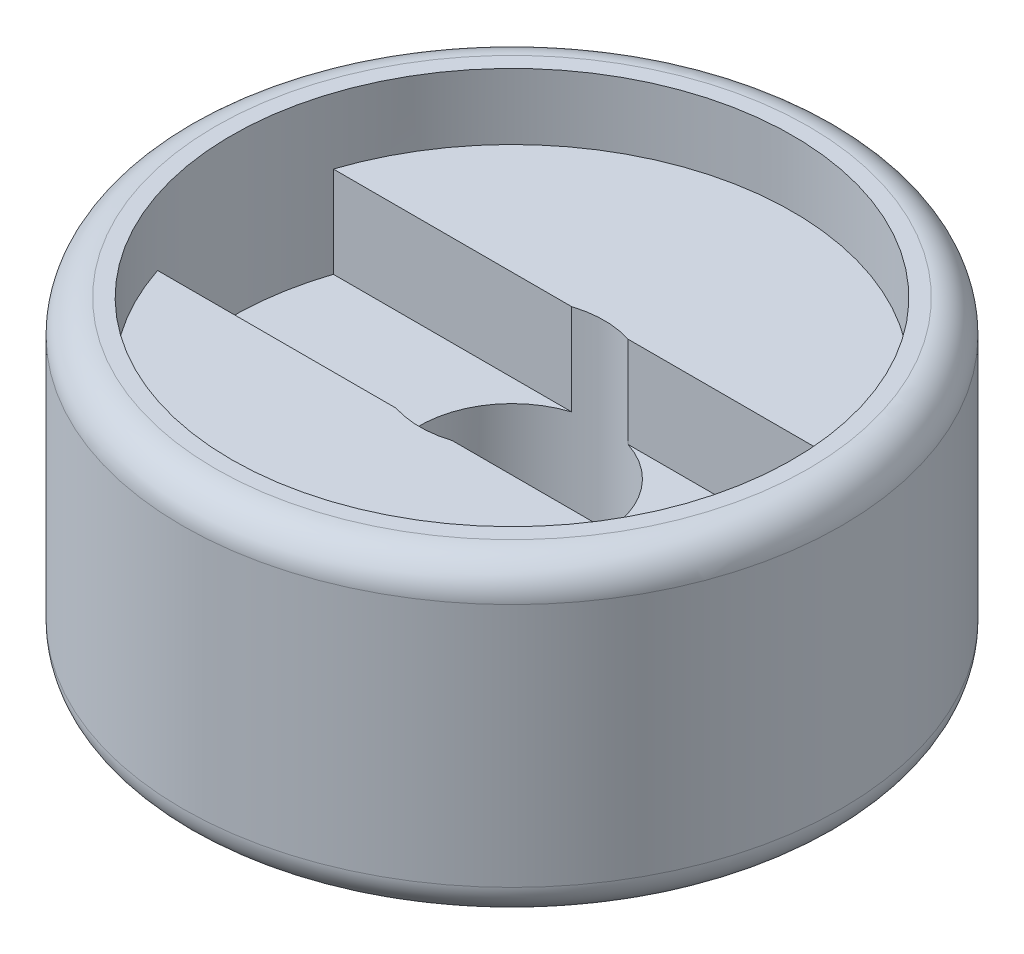
ISO-10303-21;
HEADER;
FILE_DESCRIPTION(('STEP AP214'),'2;1');
FILE_NAME('part.step','',(''),(''),'','','');
FILE_SCHEMA(('AUTOMOTIVE_DESIGN { 1 0 10303 214 1 1 1 1 }'));
ENDSEC;
DATA;
#1=APPLICATION_CONTEXT('core data for automotive mechanical design processes');
#2=APPLICATION_PROTOCOL_DEFINITION('international standard','automotive_design',2000,#1);
#3=PRODUCT_CONTEXT('',#1,'mechanical');
#4=PRODUCT('Part','Part','',(#3));
#5=PRODUCT_RELATED_PRODUCT_CATEGORY('part','',(#4));
#6=PRODUCT_DEFINITION_FORMATION('','',#4);
#7=PRODUCT_DEFINITION_CONTEXT('part definition',#1,'design');
#8=PRODUCT_DEFINITION('design','',#6,#7);
#9=PRODUCT_DEFINITION_SHAPE('','',#8);
#10=(LENGTH_UNIT() NAMED_UNIT(*) SI_UNIT(.MILLI.,.METRE.));
#11=(NAMED_UNIT(*) PLANE_ANGLE_UNIT() SI_UNIT($,.RADIAN.));
#12=(NAMED_UNIT(*) SI_UNIT($,.STERADIAN.) SOLID_ANGLE_UNIT());
#13=UNCERTAINTY_MEASURE_WITH_UNIT(LENGTH_MEASURE(1.E-05),#10,'distance_accuracy_value','');
#14=(GEOMETRIC_REPRESENTATION_CONTEXT(3) GLOBAL_UNCERTAINTY_ASSIGNED_CONTEXT((#13)) GLOBAL_UNIT_ASSIGNED_CONTEXT((#10,
#11,#12)) REPRESENTATION_CONTEXT('',''));
#15=CARTESIAN_POINT('',(0.,0.,0.));
#16=DIRECTION('',(0.,0.,1.));
#17=DIRECTION('',(1.,0.,0.));
#18=AXIS2_PLACEMENT_3D('',#15,#16,#17);
#19=CARTESIAN_POINT('',(0.,7.,0.));
#20=DIRECTION('',(0.,1.,0.));
#21=DIRECTION('',(0.,0.,1.));
#22=AXIS2_PLACEMENT_3D('',#19,#20,#21);
#23=PLANE('',#22);
#24=DIRECTION('',(1.,0.,0.));
#25=VECTOR('',#24,1.);
#26=CARTESIAN_POINT('',(0.,7.,-4.));
#27=LINE('',#26,#25);
#28=CARTESIAN_POINT('',(-12.1326264675049,7.,-4.));
#29=VERTEX_POINT('',#28);
#30=CARTESIAN_POINT('',(-1.28062484748657,7.,-4.));
#31=VERTEX_POINT('',#30);
#32=EDGE_CURVE('E122',#29,#31,#27,.T.);
#33=ORIENTED_EDGE('',*,*,#32,.F.);
#34=CARTESIAN_POINT('',(0.,7.,0.));
#35=DIRECTION('',(0.,1.,0.));
#36=DIRECTION('',(0.,0.,1.));
#37=AXIS2_PLACEMENT_3D('',#34,#35,#36);
#38=CIRCLE('',#37,12.775);
#39=CARTESIAN_POINT('',(-12.1326264675049,7.,4.));
#40=VERTEX_POINT('',#39);
#41=EDGE_CURVE('E108',#40,#29,#38,.F.);
#42=ORIENTED_EDGE('',*,*,#41,.F.);
#43=DIRECTION('',(1.,0.,0.));
#44=VECTOR('',#43,1.);
#45=CARTESIAN_POINT('',(0.,7.,4.));
#46=LINE('',#45,#44);
#47=CARTESIAN_POINT('',(-1.28062484748657,7.,4.));
#48=VERTEX_POINT('',#47);
#49=EDGE_CURVE('E120',#40,#48,#46,.T.);
#50=ORIENTED_EDGE('',*,*,#49,.T.);
#51=CARTESIAN_POINT('',(0.,7.,0.));
#52=DIRECTION('',(0.,1.,0.));
#53=DIRECTION('',(0.,0.,1.));
#54=AXIS2_PLACEMENT_3D('',#51,#52,#53);
#55=CIRCLE('',#54,4.2);
#56=EDGE_CURVE('E171',#31,#48,#55,.T.);
#57=ORIENTED_EDGE('',*,*,#56,.F.);
#58=EDGE_LOOP('',(#33,#42,#50,#57));
#59=FACE_BOUND('',#58,.T.);
#60=ADVANCED_FACE('F41',(#59),#23,.T.);
#61=CARTESIAN_POINT('',(1.28062484748657,7.,4.));
#62=VERTEX_POINT('',#61);
#63=CARTESIAN_POINT('',(12.1326264675049,7.,4.));
#64=VERTEX_POINT('',#63);
#65=EDGE_CURVE('E64',#62,#64,#46,.T.);
#66=ORIENTED_EDGE('',*,*,#65,.T.);
#67=CARTESIAN_POINT('',(12.1326264675049,7.,-4.));
#68=VERTEX_POINT('',#67);
#69=EDGE_CURVE('E124',#68,#64,#38,.F.);
#70=ORIENTED_EDGE('',*,*,#69,.F.);
#71=CARTESIAN_POINT('',(1.28062484748657,7.,-4.));
#72=VERTEX_POINT('',#71);
#73=EDGE_CURVE('E152',#72,#68,#27,.T.);
#74=ORIENTED_EDGE('',*,*,#73,.F.);
#75=EDGE_CURVE('E170',#62,#72,#55,.T.);
#76=ORIENTED_EDGE('',*,*,#75,.F.);
#77=EDGE_LOOP('',(#66,#70,#74,#76));
#78=FACE_BOUND('',#77,.T.);
#79=ADVANCED_FACE('F278',(#78),#23,.T.);
#80=CARTESIAN_POINT('',(0.,11.15,-4.));
#81=DIRECTION('',(0.,0.,-1.));
#82=DIRECTION('',(-1.,0.,0.));
#83=AXIS2_PLACEMENT_3D('',#80,#81,#82);
#84=PLANE('',#83);
#85=DIRECTION('',(0.,1.,0.));
#86=VECTOR('',#85,1.);
#87=CARTESIAN_POINT('',(-12.1326264675049,-35.4264068711929,-4.));
#88=LINE('',#87,#86);
#89=CARTESIAN_POINT('',(-12.1326264675049,11.15,-4.));
#90=VERTEX_POINT('',#89);
#91=EDGE_CURVE('E226',#29,#90,#88,.T.);
#92=ORIENTED_EDGE('',*,*,#91,.F.);
#93=ORIENTED_EDGE('',*,*,#32,.T.);
#94=DIRECTION('',(0.,-1.,0.));
#95=VECTOR('',#94,1.);
#96=CARTESIAN_POINT('',(-1.28062484748657,11.15,-4.));
#97=LINE('',#96,#95);
#98=CARTESIAN_POINT('',(-1.28062484748657,11.15,-4.));
#99=VERTEX_POINT('',#98);
#100=EDGE_CURVE('E162',#99,#31,#97,.T.);
#101=ORIENTED_EDGE('',*,*,#100,.F.);
#102=DIRECTION('',(1.,0.,0.));
#103=VECTOR('',#102,1.);
#104=CARTESIAN_POINT('',(0.,11.15,-4.));
#105=LINE('',#104,#103);
#106=EDGE_CURVE('E148',#90,#99,#105,.T.);
#107=ORIENTED_EDGE('',*,*,#106,.F.);
#108=EDGE_LOOP('',(#92,#93,#101,#107));
#109=FACE_BOUND('',#108,.T.);
#110=ADVANCED_FACE('F263',(#109),#84,.F.);
#111=DIRECTION('',(0.,1.,0.));
#112=VECTOR('',#111,1.);
#113=CARTESIAN_POINT('',(12.1326264675049,-35.4264068711929,-4.));
#114=LINE('',#113,#112);
#115=CARTESIAN_POINT('',(12.1326264675049,11.15,-4.));
#116=VERTEX_POINT('',#115);
#117=EDGE_CURVE('E223',#116,#68,#114,.F.);
#118=ORIENTED_EDGE('',*,*,#117,.F.);
#119=CARTESIAN_POINT('',(1.28062484748657,11.15,-4.));
#120=VERTEX_POINT('',#119);
#121=EDGE_CURVE('E153',#120,#116,#105,.T.);
#122=ORIENTED_EDGE('',*,*,#121,.F.);
#123=DIRECTION('',(0.,-1.,0.));
#124=VECTOR('',#123,1.);
#125=CARTESIAN_POINT('',(1.28062484748657,11.15,-4.));
#126=LINE('',#125,#124);
#127=EDGE_CURVE('E158',#120,#72,#126,.T.);
#128=ORIENTED_EDGE('',*,*,#127,.T.);
#129=ORIENTED_EDGE('',*,*,#73,.T.);
#130=EDGE_LOOP('',(#118,#122,#128,#129));
#131=FACE_BOUND('',#130,.T.);
#132=ADVANCED_FACE('F274',(#131),#84,.F.);
#133=CARTESIAN_POINT('',(0.,11.15,0.));
#134=DIRECTION('',(0.,1.,0.));
#135=DIRECTION('',(0.,0.,1.));
#136=AXIS2_PLACEMENT_3D('',#133,#134,#135);
#137=PLANE('',#136);
#138=ORIENTED_EDGE('',*,*,#121,.T.);
#139=CARTESIAN_POINT('',(0.,11.15,0.));
#140=DIRECTION('',(0.,1.,0.));
#141=DIRECTION('',(0.,0.,1.));
#142=AXIS2_PLACEMENT_3D('',#139,#140,#141);
#143=CIRCLE('',#142,12.775);
#144=EDGE_CURVE('E115',#116,#90,#143,.T.);
#145=ORIENTED_EDGE('',*,*,#144,.T.);
#146=ORIENTED_EDGE('',*,*,#106,.T.);
#147=CARTESIAN_POINT('',(0.,11.15,0.));
#148=DIRECTION('',(0.,1.,0.));
#149=DIRECTION('',(0.,0.,1.));
#150=AXIS2_PLACEMENT_3D('',#147,#148,#149);
#151=CIRCLE('',#150,4.2);
#152=EDGE_CURVE('E151',#99,#120,#151,.F.);
#153=ORIENTED_EDGE('',*,*,#152,.T.);
#154=EDGE_LOOP('',(#138,#145,#146,#153));
#155=FACE_BOUND('',#154,.T.);
#156=ADVANCED_FACE('F267',(#155),#137,.T.);
#157=CARTESIAN_POINT('',(0.,11.15,4.));
#158=DIRECTION('',(0.,0.,-1.));
#159=DIRECTION('',(-1.,0.,0.));
#160=AXIS2_PLACEMENT_3D('',#157,#158,#159);
#161=PLANE('',#160);
#162=ORIENTED_EDGE('',*,*,#49,.F.);
#163=DIRECTION('',(0.,1.,0.));
#164=VECTOR('',#163,1.);
#165=CARTESIAN_POINT('',(-12.1326264675049,-35.4264068711929,4.));
#166=LINE('',#165,#164);
#167=CARTESIAN_POINT('',(-12.1326264675049,11.15,4.));
#168=VERTEX_POINT('',#167);
#169=EDGE_CURVE('E105',#40,#168,#166,.T.);
#170=ORIENTED_EDGE('',*,*,#169,.T.);
#171=DIRECTION('',(1.,0.,0.));
#172=VECTOR('',#171,1.);
#173=CARTESIAN_POINT('',(0.,11.15,4.));
#174=LINE('',#173,#172);
#175=CARTESIAN_POINT('',(-1.28062484748657,11.15,4.));
#176=VERTEX_POINT('',#175);
#177=EDGE_CURVE('E135',#168,#176,#174,.T.);
#178=ORIENTED_EDGE('',*,*,#177,.T.);
#179=DIRECTION('',(0.,-1.,0.));
#180=VECTOR('',#179,1.);
#181=CARTESIAN_POINT('',(-1.28062484748657,11.15,4.));
#182=LINE('',#181,#180);
#183=EDGE_CURVE('E128',#176,#48,#182,.T.);
#184=ORIENTED_EDGE('',*,*,#183,.T.);
#185=EDGE_LOOP('',(#162,#170,#178,#184));
#186=FACE_BOUND('',#185,.T.);
#187=ADVANCED_FACE('F126',(#186),#161,.T.);
#188=CARTESIAN_POINT('',(1.28062484748657,11.15,4.));
#189=VERTEX_POINT('',#188);
#190=CARTESIAN_POINT('',(12.1326264675049,11.15,4.));
#191=VERTEX_POINT('',#190);
#192=EDGE_CURVE('E248',#189,#191,#174,.T.);
#193=ORIENTED_EDGE('',*,*,#192,.T.);
#194=DIRECTION('',(0.,1.,0.));
#195=VECTOR('',#194,1.);
#196=CARTESIAN_POINT('',(12.1326264675049,-35.4264068711929,4.));
#197=LINE('',#196,#195);
#198=EDGE_CURVE('E57',#191,#64,#197,.F.);
#199=ORIENTED_EDGE('',*,*,#198,.T.);
#200=ORIENTED_EDGE('',*,*,#65,.F.);
#201=DIRECTION('',(0.,-1.,0.));
#202=VECTOR('',#201,1.);
#203=CARTESIAN_POINT('',(1.28062484748657,11.15,4.));
#204=LINE('',#203,#202);
#205=EDGE_CURVE('E145',#189,#62,#204,.T.);
#206=ORIENTED_EDGE('',*,*,#205,.F.);
#207=EDGE_LOOP('',(#193,#199,#200,#206));
#208=FACE_BOUND('',#207,.T.);
#209=ADVANCED_FACE('F279',(#208),#161,.T.);
#210=CARTESIAN_POINT('',(0.,11.15,0.));
#211=DIRECTION('',(0.,1.,0.));
#212=DIRECTION('',(0.,0.,1.));
#213=AXIS2_PLACEMENT_3D('',#210,#211,#212);
#214=PLANE('',#213);
#215=ORIENTED_EDGE('',*,*,#177,.F.);
#216=CARTESIAN_POINT('',(0.,11.15,0.));
#217=DIRECTION('',(0.,1.,0.));
#218=DIRECTION('',(0.,0.,1.));
#219=AXIS2_PLACEMENT_3D('',#216,#217,#218);
#220=CIRCLE('',#219,12.775);
#221=EDGE_CURVE('E110',#168,#191,#220,.T.);
#222=ORIENTED_EDGE('',*,*,#221,.T.);
#223=ORIENTED_EDGE('',*,*,#192,.F.);
#224=CARTESIAN_POINT('',(0.,11.15,0.));
#225=DIRECTION('',(0.,1.,0.));
#226=DIRECTION('',(0.,0.,1.));
#227=AXIS2_PLACEMENT_3D('',#224,#225,#226);
#228=CIRCLE('',#227,4.2);
#229=EDGE_CURVE('E141',#189,#176,#228,.F.);
#230=ORIENTED_EDGE('',*,*,#229,.T.);
#231=EDGE_LOOP('',(#215,#222,#223,#230));
#232=FACE_BOUND('',#231,.T.);
#233=ADVANCED_FACE('F199',(#232),#214,.T.);
#234=CARTESIAN_POINT('',(0.,7.,0.));
#235=DIRECTION('',(0.,-1.,0.));
#236=DIRECTION('',(0.,0.,-1.));
#237=AXIS2_PLACEMENT_3D('',#234,#235,#236);
#238=CYLINDRICAL_SURFACE('',#237,15.);
#239=CARTESIAN_POINT('',(0.,1.5,0.));
#240=DIRECTION('',(0.,1.,0.));
#241=DIRECTION('',(0.,0.,1.));
#242=AXIS2_PLACEMENT_3D('',#239,#240,#241);
#243=CIRCLE('',#242,15.);
#244=CARTESIAN_POINT('',(0.,1.5,15.));
#245=VERTEX_POINT('',#244);
#246=EDGE_CURVE('E180',#245,#245,#243,.T.);
#247=ORIENTED_EDGE('',*,*,#246,.T.);
#248=EDGE_LOOP('',(#247));
#249=FACE_BOUND('',#248,.T.);
#250=CARTESIAN_POINT('',(0.,12.65,0.));
#251=DIRECTION('',(0.,1.,0.));
#252=DIRECTION('',(0.,0.,1.));
#253=AXIS2_PLACEMENT_3D('',#250,#251,#252);
#254=CIRCLE('',#253,15.);
#255=CARTESIAN_POINT('',(0.,12.65,15.));
#256=VERTEX_POINT('',#255);
#257=EDGE_CURVE('E176',#256,#256,#254,.F.);
#258=ORIENTED_EDGE('',*,*,#257,.T.);
#259=EDGE_LOOP('',(#258));
#260=FACE_BOUND('',#259,.T.);
#261=ADVANCED_FACE('F196',(#249,#260),#238,.T.);
#262=CARTESIAN_POINT('',(0.,0.,0.));
#263=DIRECTION('',(0.,1.,0.));
#264=DIRECTION('',(0.,0.,1.));
#265=AXIS2_PLACEMENT_3D('',#262,#263,#264);
#266=PLANE('',#265);
#267=CARTESIAN_POINT('',(0.,0.,0.));
#268=DIRECTION('',(0.,1.,0.));
#269=DIRECTION('',(0.,0.,1.));
#270=AXIS2_PLACEMENT_3D('',#267,#268,#269);
#271=CIRCLE('',#270,13.5);
#272=CARTESIAN_POINT('',(0.,0.,13.5));
#273=VERTEX_POINT('',#272);
#274=EDGE_CURVE('E50',#273,#273,#271,.F.);
#275=ORIENTED_EDGE('',*,*,#274,.T.);
#276=EDGE_LOOP('',(#275));
#277=FACE_BOUND('',#276,.T.);
#278=CARTESIAN_POINT('',(-8.22724133595217,0.,-4.75));
#279=DIRECTION('',(0.,1.,0.));
#280=DIRECTION('',(0.,0.,1.));
#281=AXIS2_PLACEMENT_3D('',#278,#279,#280);
#282=CIRCLE('',#281,2.1);
#283=CARTESIAN_POINT('',(-8.22724133595217,0.,-6.85));
#284=VERTEX_POINT('',#283);
#285=EDGE_CURVE('E137',#284,#284,#282,.T.);
#286=ORIENTED_EDGE('',*,*,#285,.T.);
#287=EDGE_LOOP('',(#286));
#288=FACE_BOUND('',#287,.T.);
#289=CARTESIAN_POINT('',(0.,0.,9.5));
#290=DIRECTION('',(0.,1.,0.));
#291=DIRECTION('',(0.,0.,1.));
#292=AXIS2_PLACEMENT_3D('',#289,#290,#291);
#293=CIRCLE('',#292,2.1);
#294=CARTESIAN_POINT('',(0.,0.,7.4));
#295=VERTEX_POINT('',#294);
#296=EDGE_CURVE('E237',#295,#295,#293,.T.);
#297=ORIENTED_EDGE('',*,*,#296,.T.);
#298=EDGE_LOOP('',(#297));
#299=FACE_BOUND('',#298,.T.);
#300=CARTESIAN_POINT('',(8.22724133595217,0.,-4.75000000000001));
#301=DIRECTION('',(0.,1.,0.));
#302=DIRECTION('',(0.,0.,1.));
#303=AXIS2_PLACEMENT_3D('',#300,#301,#302);
#304=CIRCLE('',#303,2.1);
#305=CARTESIAN_POINT('',(8.22724133595217,0.,-6.85));
#306=VERTEX_POINT('',#305);
#307=EDGE_CURVE('E228',#306,#306,#304,.T.);
#308=ORIENTED_EDGE('',*,*,#307,.T.);
#309=EDGE_LOOP('',(#308));
#310=FACE_BOUND('',#309,.T.);
#311=CARTESIAN_POINT('',(0.,0.,0.));
#312=DIRECTION('',(0.,1.,0.));
#313=DIRECTION('',(0.,0.,1.));
#314=AXIS2_PLACEMENT_3D('',#311,#312,#313);
#315=CIRCLE('',#314,4.2);
#316=CARTESIAN_POINT('',(0.,0.,4.2));
#317=VERTEX_POINT('',#316);
#318=EDGE_CURVE('E166',#317,#317,#315,.T.);
#319=ORIENTED_EDGE('',*,*,#318,.T.);
#320=EDGE_LOOP('',(#319));
#321=FACE_BOUND('',#320,.T.);
#322=ADVANCED_FACE('F187',(#277,#288,#299,#310,#321),#266,.F.);
#323=CARTESIAN_POINT('',(0.,18.879393923934,0.));
#324=DIRECTION('',(0.,-1.,0.));
#325=DIRECTION('',(0.,0.,-1.));
#326=AXIS2_PLACEMENT_3D('',#323,#324,#325);
#327=CYLINDRICAL_SURFACE('',#326,4.2);
#328=ORIENTED_EDGE('',*,*,#318,.F.);
#329=EDGE_LOOP('',(#328));
#330=FACE_BOUND('',#329,.T.);
#331=ORIENTED_EDGE('',*,*,#56,.T.);
#332=ORIENTED_EDGE('',*,*,#183,.F.);
#333=ORIENTED_EDGE('',*,*,#229,.F.);
#334=ORIENTED_EDGE('',*,*,#205,.T.);
#335=ORIENTED_EDGE('',*,*,#75,.T.);
#336=ORIENTED_EDGE('',*,*,#127,.F.);
#337=ORIENTED_EDGE('',*,*,#152,.F.);
#338=ORIENTED_EDGE('',*,*,#100,.T.);
#339=EDGE_LOOP('',(#331,#332,#333,#334,#335,#336,#337,#338));
#340=FACE_BOUND('',#339,.T.);
#341=ADVANCED_FACE('F257',(#330,#340),#327,.F.);
#342=CARTESIAN_POINT('',(8.22724133595217,6.5,-4.75000000000001));
#343=DIRECTION('',(0.,-1.,0.));
#344=DIRECTION('',(0.,0.,-1.));
#345=AXIS2_PLACEMENT_3D('',#342,#343,#344);
#346=CYLINDRICAL_SURFACE('',#345,2.1);
#347=CARTESIAN_POINT('',(8.22724133595217,6.5,-4.75000000000001));
#348=DIRECTION('',(0.,1.,0.));
#349=DIRECTION('',(0.,0.,1.));
#350=AXIS2_PLACEMENT_3D('',#347,#348,#349);
#351=CIRCLE('',#350,2.1);
#352=CARTESIAN_POINT('',(8.22724133595217,6.5,-6.85));
#353=VERTEX_POINT('',#352);
#354=EDGE_CURVE('E241',#353,#353,#351,.T.);
#355=CARTESIAN_POINT('',(8.22724133595217,6.5,-6.85));
#356=CARTESIAN_POINT('',(8.22724133595217,6.43229166666667,-6.85));
#357=CARTESIAN_POINT('',(8.22724133595217,6.36458333333333,-6.85));
#358=CARTESIAN_POINT('',(8.22724133595217,6.22916666666667,-6.85));
#359=CARTESIAN_POINT('',(8.22724133595217,6.16145833333333,-6.85));
#360=CARTESIAN_POINT('',(8.22724133595217,6.02604166666667,-6.85));
#361=CARTESIAN_POINT('',(8.22724133595217,5.95833333333333,-6.85));
#362=CARTESIAN_POINT('',(8.22724133595217,5.82291666666667,-6.85));
#363=CARTESIAN_POINT('',(8.22724133595217,5.75520833333333,-6.85));
#364=CARTESIAN_POINT('',(8.22724133595217,5.61979166666667,-6.85));
#365=CARTESIAN_POINT('',(8.22724133595217,5.55208333333333,-6.85));
#366=CARTESIAN_POINT('',(8.22724133595217,5.41666666666667,-6.85));
#367=CARTESIAN_POINT('',(8.22724133595217,5.34895833333333,-6.85));
#368=CARTESIAN_POINT('',(8.22724133595217,5.21354166666667,-6.85));
#369=CARTESIAN_POINT('',(8.22724133595217,5.14583333333333,-6.85));
#370=CARTESIAN_POINT('',(8.22724133595217,5.01041666666667,-6.85));
#371=CARTESIAN_POINT('',(8.22724133595217,4.94270833333333,-6.85));
#372=CARTESIAN_POINT('',(8.22724133595217,4.80729166666667,-6.85));
#373=CARTESIAN_POINT('',(8.22724133595217,4.73958333333333,-6.85));
#374=CARTESIAN_POINT('',(8.22724133595217,4.60416666666667,-6.85));
#375=CARTESIAN_POINT('',(8.22724133595217,4.53645833333333,-6.85));
#376=CARTESIAN_POINT('',(8.22724133595217,4.40104166666667,-6.85));
#377=CARTESIAN_POINT('',(8.22724133595217,4.33333333333333,-6.85));
#378=CARTESIAN_POINT('',(8.22724133595217,4.19791666666667,-6.85));
#379=CARTESIAN_POINT('',(8.22724133595217,4.13020833333333,-6.85));
#380=CARTESIAN_POINT('',(8.22724133595217,3.99479166666667,-6.85));
#381=CARTESIAN_POINT('',(8.22724133595217,3.92708333333333,-6.85));
#382=CARTESIAN_POINT('',(8.22724133595217,3.79166666666667,-6.85));
#383=CARTESIAN_POINT('',(8.22724133595217,3.72395833333333,-6.85));
#384=CARTESIAN_POINT('',(8.22724133595217,3.58854166666667,-6.85));
#385=CARTESIAN_POINT('',(8.22724133595217,3.52083333333333,-6.85));
#386=CARTESIAN_POINT('',(8.22724133595217,3.38541666666667,-6.85));
#387=CARTESIAN_POINT('',(8.22724133595217,3.31770833333333,-6.85));
#388=CARTESIAN_POINT('',(8.22724133595217,3.18229166666667,-6.85));
#389=CARTESIAN_POINT('',(8.22724133595217,3.11458333333333,-6.85));
#390=CARTESIAN_POINT('',(8.22724133595217,2.97916666666667,-6.85));
#391=CARTESIAN_POINT('',(8.22724133595217,2.91145833333333,-6.85));
#392=CARTESIAN_POINT('',(8.22724133595217,2.77604166666667,-6.85));
#393=CARTESIAN_POINT('',(8.22724133595217,2.70833333333333,-6.85));
#394=CARTESIAN_POINT('',(8.22724133595217,2.57291666666667,-6.85));
#395=CARTESIAN_POINT('',(8.22724133595217,2.50520833333333,-6.85));
#396=CARTESIAN_POINT('',(8.22724133595217,2.36979166666667,-6.85));
#397=CARTESIAN_POINT('',(8.22724133595217,2.30208333333333,-6.85));
#398=CARTESIAN_POINT('',(8.22724133595217,2.16666666666667,-6.85));
#399=CARTESIAN_POINT('',(8.22724133595217,2.09895833333333,-6.85));
#400=CARTESIAN_POINT('',(8.22724133595217,1.96354166666667,-6.85));
#401=CARTESIAN_POINT('',(8.22724133595217,1.89583333333333,-6.85));
#402=CARTESIAN_POINT('',(8.22724133595217,1.76041666666667,-6.85));
#403=CARTESIAN_POINT('',(8.22724133595217,1.69270833333333,-6.85));
#404=CARTESIAN_POINT('',(8.22724133595217,1.55729166666667,-6.85));
#405=CARTESIAN_POINT('',(8.22724133595217,1.48958333333333,-6.85));
#406=CARTESIAN_POINT('',(8.22724133595217,1.35416666666667,-6.85));
#407=CARTESIAN_POINT('',(8.22724133595217,1.28645833333333,-6.85));
#408=CARTESIAN_POINT('',(8.22724133595217,1.15104166666667,-6.85));
#409=CARTESIAN_POINT('',(8.22724133595217,1.08333333333333,-6.85));
#410=CARTESIAN_POINT('',(8.22724133595217,0.947916666666667,-6.85));
#411=CARTESIAN_POINT('',(8.22724133595217,0.880208333333333,-6.85));
#412=CARTESIAN_POINT('',(8.22724133595217,0.744791666666667,-6.85));
#413=CARTESIAN_POINT('',(8.22724133595217,0.677083333333333,-6.85));
#414=CARTESIAN_POINT('',(8.22724133595217,0.541666666666667,-6.85));
#415=CARTESIAN_POINT('',(8.22724133595217,0.473958333333333,-6.85));
#416=CARTESIAN_POINT('',(8.22724133595217,0.338541666666667,-6.85));
#417=CARTESIAN_POINT('',(8.22724133595217,0.270833333333334,-6.85));
#418=CARTESIAN_POINT('',(8.22724133595217,0.135416666666667,-6.85));
#419=CARTESIAN_POINT('',(8.22724133595217,0.0677083333333334,-6.85));
#420=CARTESIAN_POINT('',(8.22724133595217,0.,-6.85));
#421=B_SPLINE_CURVE_WITH_KNOTS('',3,(#355,#356,#357,#358,#359,#360,#361,#362,#363,#364,#365,
#366,#367,#368,#369,#370,#371,#372,#373,#374,#375,#376,#377,#378,#379,#380,#381,#382,#383,#384,
#385,#386,#387,#388,#389,#390,#391,#392,#393,#394,#395,#396,#397,#398,#399,#400,#401,#402,#403,
#404,#405,#406,#407,#408,#409,#410,#411,#412,#413,#414,#415,#416,#417,#418,#419,#420),
.UNSPECIFIED.,.F.,.F.,(4,2,2,2,2,2,2,2,2,2,2,2,2,2,2,2,2,2,2,2,2,2,2,2,2,2,2,2,2,2,2,2,4),(0.,
0.203125,0.40625,0.609375000000001,0.812500000000001,1.015625,1.21875,1.421875,1.625,1.828125,
2.03125,2.234375,2.4375,2.640625,2.84375,3.046875,3.25,3.453125,3.65625,3.859375,4.0625,
4.265625,4.46875,4.671875,4.875,5.078125,5.28125,5.484375,5.6875,5.890625,6.09375,6.296875,6.5),.UNSPECIFIED.);
#422=EDGE_CURVE('BSEAM300',#353,#306,#421,.T.);
#423=ORIENTED_EDGE('',*,*,#354,.T.);
#424=ORIENTED_EDGE('',*,*,#307,.F.);
#425=ORIENTED_EDGE('',*,*,#422,.T.);
#426=ORIENTED_EDGE('',*,*,#422,.F.);
#427=EDGE_LOOP('',(#423,#425,#424,#426));
#428=FACE_BOUND('',#427,.T.);
#429=ADVANCED_FACE('F300',(#428),#346,.F.);
#430=CARTESIAN_POINT('',(0.,6.5,0.));
#431=DIRECTION('',(0.,1.,0.));
#432=DIRECTION('',(0.,0.,1.));
#433=AXIS2_PLACEMENT_3D('',#430,#431,#432);
#434=PLANE('',#433);
#435=ORIENTED_EDGE('',*,*,#354,.F.);
#436=EDGE_LOOP('',(#435));
#437=FACE_BOUND('',#436,.T.);
#438=ADVANCED_FACE('F305',(#437),#434,.F.);
#439=CARTESIAN_POINT('',(0.,6.5,9.5));
#440=DIRECTION('',(0.,-1.,0.));
#441=DIRECTION('',(0.,0.,-1.));
#442=AXIS2_PLACEMENT_3D('',#439,#440,#441);
#443=CYLINDRICAL_SURFACE('',#442,2.1);
#444=CARTESIAN_POINT('',(0.,6.5,9.5));
#445=DIRECTION('',(0.,1.,0.));
#446=DIRECTION('',(0.,0.,1.));
#447=AXIS2_PLACEMENT_3D('',#444,#445,#446);
#448=CIRCLE('',#447,2.1);
#449=CARTESIAN_POINT('',(0.,6.5,7.4));
#450=VERTEX_POINT('',#449);
#451=EDGE_CURVE('E233',#450,#450,#448,.T.);
#452=CARTESIAN_POINT('',(0.,6.5,7.4));
#453=CARTESIAN_POINT('',(0.,6.43229166666667,7.4));
#454=CARTESIAN_POINT('',(0.,6.36458333333333,7.4));
#455=CARTESIAN_POINT('',(0.,6.22916666666667,7.4));
#456=CARTESIAN_POINT('',(0.,6.16145833333333,7.4));
#457=CARTESIAN_POINT('',(0.,6.02604166666667,7.4));
#458=CARTESIAN_POINT('',(0.,5.95833333333333,7.4));
#459=CARTESIAN_POINT('',(0.,5.82291666666667,7.4));
#460=CARTESIAN_POINT('',(0.,5.75520833333333,7.4));
#461=CARTESIAN_POINT('',(0.,5.61979166666667,7.4));
#462=CARTESIAN_POINT('',(0.,5.55208333333333,7.4));
#463=CARTESIAN_POINT('',(0.,5.41666666666667,7.4));
#464=CARTESIAN_POINT('',(0.,5.34895833333333,7.4));
#465=CARTESIAN_POINT('',(0.,5.21354166666667,7.4));
#466=CARTESIAN_POINT('',(0.,5.14583333333333,7.4));
#467=CARTESIAN_POINT('',(0.,5.01041666666667,7.4));
#468=CARTESIAN_POINT('',(0.,4.94270833333333,7.4));
#469=CARTESIAN_POINT('',(0.,4.80729166666667,7.4));
#470=CARTESIAN_POINT('',(0.,4.73958333333333,7.4));
#471=CARTESIAN_POINT('',(0.,4.60416666666667,7.4));
#472=CARTESIAN_POINT('',(0.,4.53645833333333,7.4));
#473=CARTESIAN_POINT('',(0.,4.40104166666667,7.4));
#474=CARTESIAN_POINT('',(0.,4.33333333333333,7.4));
#475=CARTESIAN_POINT('',(0.,4.19791666666667,7.4));
#476=CARTESIAN_POINT('',(0.,4.13020833333333,7.4));
#477=CARTESIAN_POINT('',(0.,3.99479166666667,7.4));
#478=CARTESIAN_POINT('',(0.,3.92708333333333,7.4));
#479=CARTESIAN_POINT('',(0.,3.79166666666667,7.4));
#480=CARTESIAN_POINT('',(0.,3.72395833333333,7.4));
#481=CARTESIAN_POINT('',(0.,3.58854166666667,7.4));
#482=CARTESIAN_POINT('',(0.,3.52083333333333,7.4));
#483=CARTESIAN_POINT('',(0.,3.38541666666667,7.4));
#484=CARTESIAN_POINT('',(0.,3.31770833333333,7.4));
#485=CARTESIAN_POINT('',(0.,3.18229166666667,7.4));
#486=CARTESIAN_POINT('',(0.,3.11458333333333,7.4));
#487=CARTESIAN_POINT('',(0.,2.97916666666667,7.4));
#488=CARTESIAN_POINT('',(0.,2.91145833333333,7.4));
#489=CARTESIAN_POINT('',(0.,2.77604166666667,7.4));
#490=CARTESIAN_POINT('',(0.,2.70833333333333,7.4));
#491=CARTESIAN_POINT('',(0.,2.57291666666667,7.4));
#492=CARTESIAN_POINT('',(0.,2.50520833333333,7.4));
#493=CARTESIAN_POINT('',(0.,2.36979166666667,7.4));
#494=CARTESIAN_POINT('',(0.,2.30208333333333,7.4));
#495=CARTESIAN_POINT('',(0.,2.16666666666667,7.4));
#496=CARTESIAN_POINT('',(0.,2.09895833333333,7.4));
#497=CARTESIAN_POINT('',(0.,1.96354166666667,7.4));
#498=CARTESIAN_POINT('',(0.,1.89583333333333,7.4));
#499=CARTESIAN_POINT('',(0.,1.76041666666667,7.4));
#500=CARTESIAN_POINT('',(0.,1.69270833333333,7.4));
#501=CARTESIAN_POINT('',(0.,1.55729166666667,7.4));
#502=CARTESIAN_POINT('',(0.,1.48958333333333,7.4));
#503=CARTESIAN_POINT('',(0.,1.35416666666667,7.4));
#504=CARTESIAN_POINT('',(0.,1.28645833333333,7.4));
#505=CARTESIAN_POINT('',(0.,1.15104166666667,7.4));
#506=CARTESIAN_POINT('',(0.,1.08333333333333,7.4));
#507=CARTESIAN_POINT('',(0.,0.947916666666667,7.4));
#508=CARTESIAN_POINT('',(0.,0.880208333333333,7.4));
#509=CARTESIAN_POINT('',(0.,0.744791666666667,7.4));
#510=CARTESIAN_POINT('',(0.,0.677083333333333,7.4));
#511=CARTESIAN_POINT('',(0.,0.541666666666667,7.4));
#512=CARTESIAN_POINT('',(0.,0.473958333333333,7.4));
#513=CARTESIAN_POINT('',(0.,0.338541666666667,7.4));
#514=CARTESIAN_POINT('',(0.,0.270833333333334,7.4));
#515=CARTESIAN_POINT('',(0.,0.135416666666667,7.4));
#516=CARTESIAN_POINT('',(0.,0.0677083333333334,7.4));
#517=CARTESIAN_POINT('',(0.,0.,7.4));
#518=B_SPLINE_CURVE_WITH_KNOTS('',3,(#452,#453,#454,#455,#456,#457,#458,#459,#460,#461,#462,
#463,#464,#465,#466,#467,#468,#469,#470,#471,#472,#473,#474,#475,#476,#477,#478,#479,#480,#481,
#482,#483,#484,#485,#486,#487,#488,#489,#490,#491,#492,#493,#494,#495,#496,#497,#498,#499,#500,
#501,#502,#503,#504,#505,#506,#507,#508,#509,#510,#511,#512,#513,#514,#515,#516,#517),
.UNSPECIFIED.,.F.,.F.,(4,2,2,2,2,2,2,2,2,2,2,2,2,2,2,2,2,2,2,2,2,2,2,2,2,2,2,2,2,2,2,2,4),(0.,
0.203125,0.40625,0.609375000000001,0.812500000000001,1.015625,1.21875,1.421875,1.625,1.828125,
2.03125,2.234375,2.4375,2.640625,2.84375,3.046875,3.25,3.453125,3.65625,3.859375,4.0625,
4.265625,4.46875,4.671875,4.875,5.078125,5.28125,5.484375,5.6875,5.890625,6.09375,6.296875,6.5),.UNSPECIFIED.);
#519=EDGE_CURVE('BSEAM313',#450,#295,#518,.T.);
#520=ORIENTED_EDGE('',*,*,#451,.T.);
#521=ORIENTED_EDGE('',*,*,#296,.F.);
#522=ORIENTED_EDGE('',*,*,#519,.T.);
#523=ORIENTED_EDGE('',*,*,#519,.F.);
#524=EDGE_LOOP('',(#520,#522,#521,#523));
#525=FACE_BOUND('',#524,.T.);
#526=ADVANCED_FACE('F313',(#525),#443,.F.);
#527=CARTESIAN_POINT('',(0.,6.5,0.));
#528=DIRECTION('',(0.,1.,0.));
#529=DIRECTION('',(0.,0.,1.));
#530=AXIS2_PLACEMENT_3D('',#527,#528,#529);
#531=PLANE('',#530);
#532=ORIENTED_EDGE('',*,*,#451,.F.);
#533=EDGE_LOOP('',(#532));
#534=FACE_BOUND('',#533,.T.);
#535=ADVANCED_FACE('F320',(#534),#531,.F.);
#536=CARTESIAN_POINT('',(-8.22724133595217,6.5,-4.75));
#537=DIRECTION('',(0.,-1.,0.));
#538=DIRECTION('',(0.,0.,-1.));
#539=AXIS2_PLACEMENT_3D('',#536,#537,#538);
#540=CYLINDRICAL_SURFACE('',#539,2.1);
#541=CARTESIAN_POINT('',(-8.22724133595217,6.5,-4.75));
#542=DIRECTION('',(0.,1.,0.));
#543=DIRECTION('',(0.,0.,1.));
#544=AXIS2_PLACEMENT_3D('',#541,#542,#543);
#545=CIRCLE('',#544,2.1);
#546=CARTESIAN_POINT('',(-8.22724133595217,6.5,-6.85));
#547=VERTEX_POINT('',#546);
#548=EDGE_CURVE('E131',#547,#547,#545,.T.);
#549=CARTESIAN_POINT('',(-8.22724133595217,6.5,-6.85));
#550=CARTESIAN_POINT('',(-8.22724133595217,6.43229166666667,-6.85));
#551=CARTESIAN_POINT('',(-8.22724133595217,6.36458333333333,-6.85));
#552=CARTESIAN_POINT('',(-8.22724133595217,6.22916666666667,-6.85));
#553=CARTESIAN_POINT('',(-8.22724133595217,6.16145833333333,-6.85));
#554=CARTESIAN_POINT('',(-8.22724133595217,6.02604166666667,-6.85));
#555=CARTESIAN_POINT('',(-8.22724133595217,5.95833333333333,-6.85));
#556=CARTESIAN_POINT('',(-8.22724133595217,5.82291666666667,-6.85));
#557=CARTESIAN_POINT('',(-8.22724133595217,5.75520833333333,-6.85));
#558=CARTESIAN_POINT('',(-8.22724133595217,5.61979166666667,-6.85));
#559=CARTESIAN_POINT('',(-8.22724133595217,5.55208333333333,-6.85));
#560=CARTESIAN_POINT('',(-8.22724133595217,5.41666666666667,-6.85));
#561=CARTESIAN_POINT('',(-8.22724133595217,5.34895833333333,-6.85));
#562=CARTESIAN_POINT('',(-8.22724133595217,5.21354166666667,-6.85));
#563=CARTESIAN_POINT('',(-8.22724133595217,5.14583333333333,-6.85));
#564=CARTESIAN_POINT('',(-8.22724133595217,5.01041666666667,-6.85));
#565=CARTESIAN_POINT('',(-8.22724133595217,4.94270833333333,-6.85));
#566=CARTESIAN_POINT('',(-8.22724133595217,4.80729166666667,-6.85));
#567=CARTESIAN_POINT('',(-8.22724133595217,4.73958333333333,-6.85));
#568=CARTESIAN_POINT('',(-8.22724133595217,4.60416666666667,-6.85));
#569=CARTESIAN_POINT('',(-8.22724133595217,4.53645833333333,-6.85));
#570=CARTESIAN_POINT('',(-8.22724133595217,4.40104166666667,-6.85));
#571=CARTESIAN_POINT('',(-8.22724133595217,4.33333333333333,-6.85));
#572=CARTESIAN_POINT('',(-8.22724133595217,4.19791666666667,-6.85));
#573=CARTESIAN_POINT('',(-8.22724133595217,4.13020833333333,-6.85));
#574=CARTESIAN_POINT('',(-8.22724133595217,3.99479166666667,-6.85));
#575=CARTESIAN_POINT('',(-8.22724133595217,3.92708333333333,-6.85));
#576=CARTESIAN_POINT('',(-8.22724133595217,3.79166666666667,-6.85));
#577=CARTESIAN_POINT('',(-8.22724133595217,3.72395833333333,-6.85));
#578=CARTESIAN_POINT('',(-8.22724133595217,3.58854166666667,-6.85));
#579=CARTESIAN_POINT('',(-8.22724133595217,3.52083333333333,-6.85));
#580=CARTESIAN_POINT('',(-8.22724133595217,3.38541666666667,-6.85));
#581=CARTESIAN_POINT('',(-8.22724133595217,3.31770833333333,-6.85));
#582=CARTESIAN_POINT('',(-8.22724133595217,3.18229166666667,-6.85));
#583=CARTESIAN_POINT('',(-8.22724133595217,3.11458333333333,-6.85));
#584=CARTESIAN_POINT('',(-8.22724133595217,2.97916666666667,-6.85));
#585=CARTESIAN_POINT('',(-8.22724133595217,2.91145833333333,-6.85));
#586=CARTESIAN_POINT('',(-8.22724133595217,2.77604166666667,-6.85));
#587=CARTESIAN_POINT('',(-8.22724133595217,2.70833333333333,-6.85));
#588=CARTESIAN_POINT('',(-8.22724133595217,2.57291666666667,-6.85));
#589=CARTESIAN_POINT('',(-8.22724133595217,2.50520833333333,-6.85));
#590=CARTESIAN_POINT('',(-8.22724133595217,2.36979166666667,-6.85));
#591=CARTESIAN_POINT('',(-8.22724133595217,2.30208333333333,-6.85));
#592=CARTESIAN_POINT('',(-8.22724133595217,2.16666666666667,-6.85));
#593=CARTESIAN_POINT('',(-8.22724133595217,2.09895833333333,-6.85));
#594=CARTESIAN_POINT('',(-8.22724133595217,1.96354166666667,-6.85));
#595=CARTESIAN_POINT('',(-8.22724133595217,1.89583333333333,-6.85));
#596=CARTESIAN_POINT('',(-8.22724133595217,1.76041666666667,-6.85));
#597=CARTESIAN_POINT('',(-8.22724133595217,1.69270833333333,-6.85));
#598=CARTESIAN_POINT('',(-8.22724133595217,1.55729166666667,-6.85));
#599=CARTESIAN_POINT('',(-8.22724133595217,1.48958333333333,-6.85));
#600=CARTESIAN_POINT('',(-8.22724133595217,1.35416666666667,-6.85));
#601=CARTESIAN_POINT('',(-8.22724133595217,1.28645833333333,-6.85));
#602=CARTESIAN_POINT('',(-8.22724133595217,1.15104166666667,-6.85));
#603=CARTESIAN_POINT('',(-8.22724133595217,1.08333333333333,-6.85));
#604=CARTESIAN_POINT('',(-8.22724133595217,0.947916666666667,-6.85));
#605=CARTESIAN_POINT('',(-8.22724133595217,0.880208333333333,-6.85));
#606=CARTESIAN_POINT('',(-8.22724133595217,0.744791666666667,-6.85));
#607=CARTESIAN_POINT('',(-8.22724133595217,0.677083333333333,-6.85));
#608=CARTESIAN_POINT('',(-8.22724133595217,0.541666666666667,-6.85));
#609=CARTESIAN_POINT('',(-8.22724133595217,0.473958333333333,-6.85));
#610=CARTESIAN_POINT('',(-8.22724133595217,0.338541666666667,-6.85));
#611=CARTESIAN_POINT('',(-8.22724133595217,0.270833333333334,-6.85));
#612=CARTESIAN_POINT('',(-8.22724133595217,0.135416666666667,-6.85));
#613=CARTESIAN_POINT('',(-8.22724133595217,0.0677083333333334,-6.85));
#614=CARTESIAN_POINT('',(-8.22724133595217,0.,-6.85));
#615=B_SPLINE_CURVE_WITH_KNOTS('',3,(#549,#550,#551,#552,#553,#554,#555,#556,#557,#558,#559,
#560,#561,#562,#563,#564,#565,#566,#567,#568,#569,#570,#571,#572,#573,#574,#575,#576,#577,#578,
#579,#580,#581,#582,#583,#584,#585,#586,#587,#588,#589,#590,#591,#592,#593,#594,#595,#596,#597,
#598,#599,#600,#601,#602,#603,#604,#605,#606,#607,#608,#609,#610,#611,#612,#613,#614),
.UNSPECIFIED.,.F.,.F.,(4,2,2,2,2,2,2,2,2,2,2,2,2,2,2,2,2,2,2,2,2,2,2,2,2,2,2,2,2,2,2,2,4),(0.,
0.203125,0.40625,0.609375000000001,0.812500000000001,1.015625,1.21875,1.421875,1.625,1.828125,
2.03125,2.234375,2.4375,2.640625,2.84375,3.046875,3.25,3.453125,3.65625,3.859375,4.0625,
4.265625,4.46875,4.671875,4.875,5.078125,5.28125,5.484375,5.6875,5.890625,6.09375,6.296875,6.5),.UNSPECIFIED.);
#616=EDGE_CURVE('BSEAM324',#547,#284,#615,.T.);
#617=ORIENTED_EDGE('',*,*,#548,.T.);
#618=ORIENTED_EDGE('',*,*,#285,.F.);
#619=ORIENTED_EDGE('',*,*,#616,.T.);
#620=ORIENTED_EDGE('',*,*,#616,.F.);
#621=EDGE_LOOP('',(#617,#619,#618,#620));
#622=FACE_BOUND('',#621,.T.);
#623=ADVANCED_FACE('F324',(#622),#540,.F.);
#624=CARTESIAN_POINT('',(0.,6.5,0.));
#625=DIRECTION('',(0.,1.,0.));
#626=DIRECTION('',(0.,0.,1.));
#627=AXIS2_PLACEMENT_3D('',#624,#625,#626);
#628=PLANE('',#627);
#629=ORIENTED_EDGE('',*,*,#548,.F.);
#630=EDGE_LOOP('',(#629));
#631=FACE_BOUND('',#630,.T.);
#632=ADVANCED_FACE('F328',(#631),#628,.F.);
#633=CARTESIAN_POINT('',(0.,-35.4264068711929,0.));
#634=DIRECTION('',(0.,1.,0.));
#635=DIRECTION('',(0.,0.,1.));
#636=AXIS2_PLACEMENT_3D('',#633,#634,#635);
#637=CYLINDRICAL_SURFACE('',#636,12.775);
#638=CARTESIAN_POINT('',(0.,14.15,0.));
#639=DIRECTION('',(0.,1.,0.));
#640=DIRECTION('',(0.,0.,1.));
#641=AXIS2_PLACEMENT_3D('',#638,#639,#640);
#642=CIRCLE('',#641,12.775);
#643=CARTESIAN_POINT('',(0.,14.15,12.775));
#644=VERTEX_POINT('',#643);
#645=EDGE_CURVE('E212',#644,#644,#642,.T.);
#646=ORIENTED_EDGE('',*,*,#645,.T.);
#647=EDGE_LOOP('',(#646));
#648=FACE_BOUND('',#647,.T.);
#649=ORIENTED_EDGE('',*,*,#41,.T.);
#650=ORIENTED_EDGE('',*,*,#91,.T.);
#651=ORIENTED_EDGE('',*,*,#144,.F.);
#652=ORIENTED_EDGE('',*,*,#117,.T.);
#653=ORIENTED_EDGE('',*,*,#69,.T.);
#654=ORIENTED_EDGE('',*,*,#198,.F.);
#655=ORIENTED_EDGE('',*,*,#221,.F.);
#656=ORIENTED_EDGE('',*,*,#169,.F.);
#657=EDGE_LOOP('',(#649,#650,#651,#652,#653,#654,#655,#656));
#658=FACE_BOUND('',#657,.T.);
#659=ADVANCED_FACE('F107',(#648,#658),#637,.F.);
#660=CARTESIAN_POINT('',(0.,14.15,0.));
#661=DIRECTION('',(0.,1.,0.));
#662=DIRECTION('',(0.,0.,1.));
#663=AXIS2_PLACEMENT_3D('',#660,#661,#662);
#664=PLANE('',#663);
#665=CARTESIAN_POINT('',(0.,14.15,0.));
#666=DIRECTION('',(0.,1.,0.));
#667=DIRECTION('',(0.,0.,1.));
#668=AXIS2_PLACEMENT_3D('',#665,#666,#667);
#669=CIRCLE('',#668,13.5);
#670=CARTESIAN_POINT('',(0.,14.15,13.5));
#671=VERTEX_POINT('',#670);
#672=EDGE_CURVE('E11',#671,#671,#669,.T.);
#673=ORIENTED_EDGE('',*,*,#672,.T.);
#674=EDGE_LOOP('',(#673));
#675=FACE_BOUND('',#674,.T.);
#676=ORIENTED_EDGE('',*,*,#645,.F.);
#677=EDGE_LOOP('',(#676));
#678=FACE_BOUND('',#677,.T.);
#679=ADVANCED_FACE('F193',(#675,#678),#664,.T.);
#680=CARTESIAN_POINT('',(0.,1.5,0.));
#681=DIRECTION('',(0.,1.,0.));
#682=DIRECTION('',(0.,0.,1.));
#683=AXIS2_PLACEMENT_3D('',#680,#681,#682);
#684=TOROIDAL_SURFACE('',#683,13.5,1.5);
#685=ORIENTED_EDGE('',*,*,#274,.F.);
#686=EDGE_LOOP('',(#685));
#687=FACE_BOUND('',#686,.T.);
#688=ORIENTED_EDGE('',*,*,#246,.F.);
#689=EDGE_LOOP('',(#688));
#690=FACE_BOUND('',#689,.T.);
#691=ADVANCED_FACE('F190',(#687,#690),#684,.T.);
#692=CARTESIAN_POINT('',(0.,12.65,0.));
#693=DIRECTION('',(0.,1.,0.));
#694=DIRECTION('',(0.,0.,1.));
#695=AXIS2_PLACEMENT_3D('',#692,#693,#694);
#696=TOROIDAL_SURFACE('',#695,13.5,1.5);
#697=ORIENTED_EDGE('',*,*,#257,.F.);
#698=EDGE_LOOP('',(#697));
#699=FACE_BOUND('',#698,.T.);
#700=ORIENTED_EDGE('',*,*,#672,.F.);
#701=EDGE_LOOP('',(#700));
#702=FACE_BOUND('',#701,.T.);
#703=ADVANCED_FACE('F43',(#699,#702),#696,.T.);
#704=CLOSED_SHELL('',(#60,#79,#110,#132,#156,#187,#209,#233,#261,#322,#341,#429,#438,#526,#535,
#623,#632,#659,#679,#691,#703));
#705=MANIFOLD_SOLID_BREP('B2',#704);
#706=ADVANCED_BREP_SHAPE_REPRESENTATION('',(#18,#705),#14);
#707=SHAPE_DEFINITION_REPRESENTATION(#9,#706);
ENDSEC;
END-ISO-10303-21;
